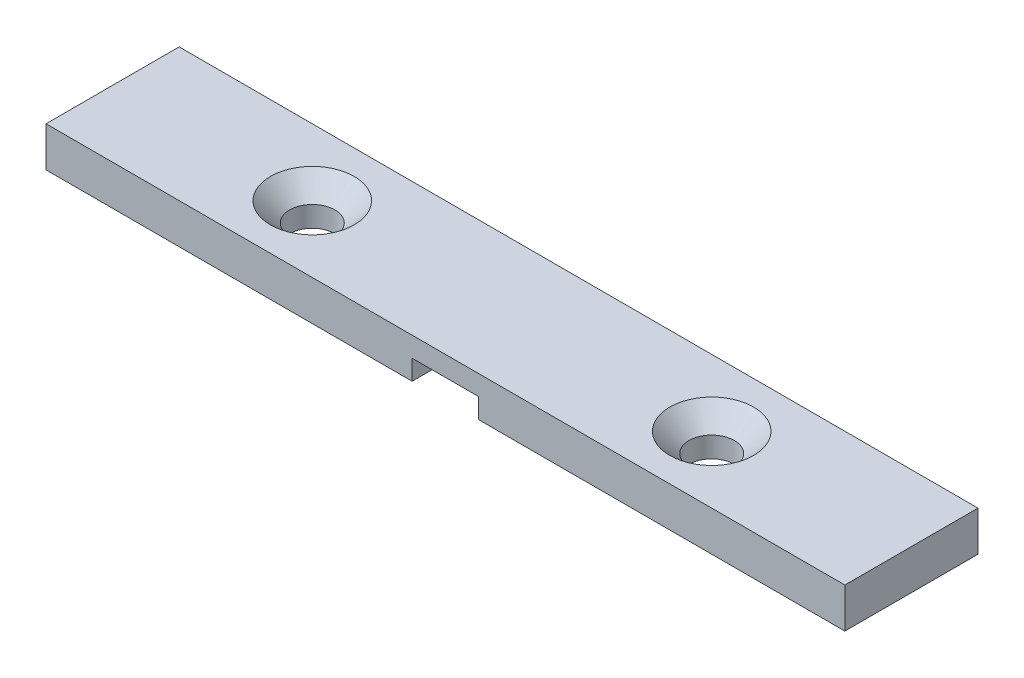
ISO-10303-21;
HEADER;
FILE_DESCRIPTION(('STEP AP214'),'2;1');
FILE_NAME('part.step','',(''),(''),'','','');
FILE_SCHEMA(('AUTOMOTIVE_DESIGN { 1 0 10303 214 1 1 1 1 }'));
ENDSEC;
DATA;
#1=APPLICATION_CONTEXT('core data for automotive mechanical design processes');
#2=APPLICATION_PROTOCOL_DEFINITION('international standard','automotive_design',2000,#1);
#3=PRODUCT_CONTEXT('',#1,'mechanical');
#4=PRODUCT('Part','Part','',(#3));
#5=PRODUCT_RELATED_PRODUCT_CATEGORY('part','',(#4));
#6=PRODUCT_DEFINITION_FORMATION('','',#4);
#7=PRODUCT_DEFINITION_CONTEXT('part definition',#1,'design');
#8=PRODUCT_DEFINITION('design','',#6,#7);
#9=PRODUCT_DEFINITION_SHAPE('','',#8);
#10=(LENGTH_UNIT() NAMED_UNIT(*) SI_UNIT(.MILLI.,.METRE.));
#11=(NAMED_UNIT(*) PLANE_ANGLE_UNIT() SI_UNIT($,.RADIAN.));
#12=(NAMED_UNIT(*) SI_UNIT($,.STERADIAN.) SOLID_ANGLE_UNIT());
#13=UNCERTAINTY_MEASURE_WITH_UNIT(LENGTH_MEASURE(1.E-05),#10,'distance_accuracy_value','');
#14=(GEOMETRIC_REPRESENTATION_CONTEXT(3) GLOBAL_UNCERTAINTY_ASSIGNED_CONTEXT((#13)) GLOBAL_UNIT_ASSIGNED_CONTEXT((#10,
#11,#12)) REPRESENTATION_CONTEXT('',''));
#15=CARTESIAN_POINT('',(0.,0.,0.));
#16=DIRECTION('',(0.,0.,1.));
#17=DIRECTION('',(1.,0.,0.));
#18=AXIS2_PLACEMENT_3D('',#15,#16,#17);
#19=CARTESIAN_POINT('',(30.,3.,-5.));
#20=DIRECTION('',(-1.,0.,0.));
#21=DIRECTION('',(0.,0.,1.));
#22=AXIS2_PLACEMENT_3D('',#19,#20,#21);
#23=PLANE('',#22);
#24=DIRECTION('',(0.,0.,-1.));
#25=VECTOR('',#24,1.);
#26=CARTESIAN_POINT('',(30.,0.,-5.));
#27=LINE('',#26,#25);
#28=CARTESIAN_POINT('',(30.,0.,5.));
#29=VERTEX_POINT('',#28);
#30=CARTESIAN_POINT('',(30.,0.,-5.));
#31=VERTEX_POINT('',#30);
#32=EDGE_CURVE('E157',#29,#31,#27,.T.);
#33=ORIENTED_EDGE('',*,*,#32,.T.);
#34=DIRECTION('',(0.,-1.,0.));
#35=VECTOR('',#34,1.);
#36=CARTESIAN_POINT('',(30.,3.,-5.));
#37=LINE('',#36,#35);
#38=CARTESIAN_POINT('',(30.,3.,-5.));
#39=VERTEX_POINT('',#38);
#40=EDGE_CURVE('E11',#39,#31,#37,.T.);
#41=ORIENTED_EDGE('',*,*,#40,.F.);
#42=DIRECTION('',(0.,0.,-1.));
#43=VECTOR('',#42,1.);
#44=CARTESIAN_POINT('',(30.,3.,-5.));
#45=LINE('',#44,#43);
#46=CARTESIAN_POINT('',(30.,3.,5.));
#47=VERTEX_POINT('',#46);
#48=EDGE_CURVE('E149',#47,#39,#45,.T.);
#49=ORIENTED_EDGE('',*,*,#48,.F.);
#50=DIRECTION('',(0.,-1.,0.));
#51=VECTOR('',#50,1.);
#52=CARTESIAN_POINT('',(30.,3.,5.));
#53=LINE('',#52,#51);
#54=EDGE_CURVE('E156',#47,#29,#53,.T.);
#55=ORIENTED_EDGE('',*,*,#54,.T.);
#56=EDGE_LOOP('',(#33,#41,#49,#55));
#57=FACE_BOUND('',#56,.T.);
#58=ADVANCED_FACE('F36',(#57),#23,.F.);
#59=CARTESIAN_POINT('',(-30.,3.,-5.));
#60=DIRECTION('',(0.,0.,1.));
#61=DIRECTION('',(1.,0.,0.));
#62=AXIS2_PLACEMENT_3D('',#59,#60,#61);
#63=PLANE('',#62);
#64=DIRECTION('',(-1.,0.,0.));
#65=VECTOR('',#64,1.);
#66=CARTESIAN_POINT('',(-30.,0.,-5.));
#67=LINE('',#66,#65);
#68=CARTESIAN_POINT('',(-30.,0.,-5.));
#69=VERTEX_POINT('',#68);
#70=EDGE_CURVE('E160',#31,#69,#67,.T.);
#71=ORIENTED_EDGE('',*,*,#70,.T.);
#72=DIRECTION('',(0.,-1.,0.));
#73=VECTOR('',#72,1.);
#74=CARTESIAN_POINT('',(-30.,3.,-5.));
#75=LINE('',#74,#73);
#76=CARTESIAN_POINT('',(-30.,3.,-5.));
#77=VERTEX_POINT('',#76);
#78=EDGE_CURVE('E44',#77,#69,#75,.T.);
#79=ORIENTED_EDGE('',*,*,#78,.F.);
#80=DIRECTION('',(-1.,0.,0.));
#81=VECTOR('',#80,1.);
#82=CARTESIAN_POINT('',(-30.,3.,-5.));
#83=LINE('',#82,#81);
#84=EDGE_CURVE('E89',#39,#77,#83,.T.);
#85=ORIENTED_EDGE('',*,*,#84,.F.);
#86=ORIENTED_EDGE('',*,*,#40,.T.);
#87=EDGE_LOOP('',(#71,#79,#85,#86));
#88=FACE_BOUND('',#87,.T.);
#89=ADVANCED_FACE('F193',(#88),#63,.F.);
#90=CARTESIAN_POINT('',(-30.,3.,-5.));
#91=DIRECTION('',(1.,0.,0.));
#92=DIRECTION('',(0.,0.,-1.));
#93=AXIS2_PLACEMENT_3D('',#90,#91,#92);
#94=PLANE('',#93);
#95=DIRECTION('',(0.,0.,1.));
#96=VECTOR('',#95,1.);
#97=CARTESIAN_POINT('',(-30.,0.,-5.));
#98=LINE('',#97,#96);
#99=CARTESIAN_POINT('',(-30.,0.,5.));
#100=VERTEX_POINT('',#99);
#101=EDGE_CURVE('E162',#69,#100,#98,.T.);
#102=ORIENTED_EDGE('',*,*,#101,.T.);
#103=DIRECTION('',(0.,-1.,0.));
#104=VECTOR('',#103,1.);
#105=CARTESIAN_POINT('',(-30.,3.,5.));
#106=LINE('',#105,#104);
#107=CARTESIAN_POINT('',(-30.,3.,5.));
#108=VERTEX_POINT('',#107);
#109=EDGE_CURVE('E167',#108,#100,#106,.T.);
#110=ORIENTED_EDGE('',*,*,#109,.F.);
#111=DIRECTION('',(0.,0.,1.));
#112=VECTOR('',#111,1.);
#113=CARTESIAN_POINT('',(-30.,3.,-5.));
#114=LINE('',#113,#112);
#115=EDGE_CURVE('E153',#77,#108,#114,.T.);
#116=ORIENTED_EDGE('',*,*,#115,.F.);
#117=ORIENTED_EDGE('',*,*,#78,.T.);
#118=EDGE_LOOP('',(#102,#110,#116,#117));
#119=FACE_BOUND('',#118,.T.);
#120=ADVANCED_FACE('F198',(#119),#94,.F.);
#121=CARTESIAN_POINT('',(-30.,3.,5.));
#122=DIRECTION('',(0.,0.,-1.));
#123=DIRECTION('',(-1.,0.,0.));
#124=AXIS2_PLACEMENT_3D('',#121,#122,#123);
#125=PLANE('',#124);
#126=DIRECTION('',(1.,0.,0.));
#127=VECTOR('',#126,1.);
#128=CARTESIAN_POINT('',(-30.,0.,5.));
#129=LINE('',#128,#127);
#130=CARTESIAN_POINT('',(-2.5,0.,5.));
#131=VERTEX_POINT('',#130);
#132=EDGE_CURVE('E151',#100,#131,#129,.T.);
#133=ORIENTED_EDGE('',*,*,#132,.T.);
#134=DIRECTION('',(0.,-1.,0.));
#135=VECTOR('',#134,1.);
#136=CARTESIAN_POINT('',(-2.5,0.,5.));
#137=LINE('',#136,#135);
#138=CARTESIAN_POINT('',(-2.5,1.5,5.));
#139=VERTEX_POINT('',#138);
#140=EDGE_CURVE('E314',#139,#131,#137,.T.);
#141=ORIENTED_EDGE('',*,*,#140,.F.);
#142=DIRECTION('',(-1.,0.,0.));
#143=VECTOR('',#142,1.);
#144=CARTESIAN_POINT('',(-2.5,1.5,5.));
#145=LINE('',#144,#143);
#146=CARTESIAN_POINT('',(2.5,1.5,5.));
#147=VERTEX_POINT('',#146);
#148=EDGE_CURVE('E310',#147,#139,#145,.T.);
#149=ORIENTED_EDGE('',*,*,#148,.F.);
#150=DIRECTION('',(0.,1.,0.));
#151=VECTOR('',#150,1.);
#152=CARTESIAN_POINT('',(2.5,0.,5.));
#153=LINE('',#152,#151);
#154=CARTESIAN_POINT('',(2.5,0.,5.));
#155=VERTEX_POINT('',#154);
#156=EDGE_CURVE('E312',#155,#147,#153,.T.);
#157=ORIENTED_EDGE('',*,*,#156,.F.);
#158=EDGE_CURVE('E82',#155,#29,#129,.T.);
#159=ORIENTED_EDGE('',*,*,#158,.T.);
#160=ORIENTED_EDGE('',*,*,#54,.F.);
#161=DIRECTION('',(1.,0.,0.));
#162=VECTOR('',#161,1.);
#163=CARTESIAN_POINT('',(-30.,3.,5.));
#164=LINE('',#163,#162);
#165=EDGE_CURVE('E61',#108,#47,#164,.T.);
#166=ORIENTED_EDGE('',*,*,#165,.F.);
#167=ORIENTED_EDGE('',*,*,#109,.T.);
#168=EDGE_LOOP('',(#133,#141,#149,#157,#159,#160,#166,#167));
#169=FACE_BOUND('',#168,.T.);
#170=ADVANCED_FACE('F207',(#169),#125,.F.);
#171=CARTESIAN_POINT('',(0.,3.,0.));
#172=DIRECTION('',(0.,1.,0.));
#173=DIRECTION('',(0.,0.,1.));
#174=AXIS2_PLACEMENT_3D('',#171,#172,#173);
#175=PLANE('',#174);
#176=CARTESIAN_POINT('',(-15.,3.,0.));
#177=DIRECTION('',(0.,1.,0.));
#178=DIRECTION('',(0.,0.,1.));
#179=AXIS2_PLACEMENT_3D('',#176,#177,#178);
#180=CIRCLE('',#179,3.15);
#181=CARTESIAN_POINT('',(-15.,3.,3.15));
#182=VERTEX_POINT('',#181);
#183=EDGE_CURVE('E136',#182,#182,#180,.T.);
#184=ORIENTED_EDGE('',*,*,#183,.F.);
#185=EDGE_LOOP('',(#184));
#186=FACE_BOUND('',#185,.T.);
#187=CARTESIAN_POINT('',(15.,3.,0.));
#188=DIRECTION('',(0.,1.,0.));
#189=DIRECTION('',(0.,0.,1.));
#190=AXIS2_PLACEMENT_3D('',#187,#188,#189);
#191=CIRCLE('',#190,3.15);
#192=CARTESIAN_POINT('',(15.,3.,3.15));
#193=VERTEX_POINT('',#192);
#194=EDGE_CURVE('E142',#193,#193,#191,.T.);
#195=ORIENTED_EDGE('',*,*,#194,.F.);
#196=EDGE_LOOP('',(#195));
#197=FACE_BOUND('',#196,.T.);
#198=ORIENTED_EDGE('',*,*,#48,.T.);
#199=ORIENTED_EDGE('',*,*,#84,.T.);
#200=ORIENTED_EDGE('',*,*,#115,.T.);
#201=ORIENTED_EDGE('',*,*,#165,.T.);
#202=EDGE_LOOP('',(#198,#199,#200,#201));
#203=FACE_BOUND('',#202,.T.);
#204=ADVANCED_FACE('F188',(#186,#197,#203),#175,.T.);
#205=CARTESIAN_POINT('',(0.,0.,0.));
#206=DIRECTION('',(0.,1.,0.));
#207=DIRECTION('',(0.,0.,1.));
#208=AXIS2_PLACEMENT_3D('',#205,#206,#207);
#209=PLANE('',#208);
#210=CARTESIAN_POINT('',(-15.,0.,0.));
#211=DIRECTION('',(0.,1.,0.));
#212=DIRECTION('',(0.,0.,1.));
#213=AXIS2_PLACEMENT_3D('',#210,#211,#212);
#214=CIRCLE('',#213,1.7);
#215=CARTESIAN_POINT('',(-15.,0.,1.7));
#216=VERTEX_POINT('',#215);
#217=EDGE_CURVE('E39',#216,#216,#214,.T.);
#218=ORIENTED_EDGE('',*,*,#217,.T.);
#219=EDGE_LOOP('',(#218));
#220=FACE_BOUND('',#219,.T.);
#221=CARTESIAN_POINT('',(15.,0.,0.));
#222=DIRECTION('',(0.,1.,0.));
#223=DIRECTION('',(0.,0.,1.));
#224=AXIS2_PLACEMENT_3D('',#221,#222,#223);
#225=CIRCLE('',#224,1.7);
#226=CARTESIAN_POINT('',(15.,0.,1.7));
#227=VERTEX_POINT('',#226);
#228=EDGE_CURVE('E148',#227,#227,#225,.T.);
#229=ORIENTED_EDGE('',*,*,#228,.T.);
#230=EDGE_LOOP('',(#229));
#231=FACE_BOUND('',#230,.T.);
#232=DIRECTION('',(1.,0.,0.));
#233=VECTOR('',#232,1.);
#234=CARTESIAN_POINT('',(-2.5,0.,-3.5));
#235=LINE('',#234,#233);
#236=CARTESIAN_POINT('',(-2.5,0.,-3.5));
#237=VERTEX_POINT('',#236);
#238=CARTESIAN_POINT('',(2.5,0.,-3.5));
#239=VERTEX_POINT('',#238);
#240=EDGE_CURVE('E120',#237,#239,#235,.T.);
#241=ORIENTED_EDGE('',*,*,#240,.F.);
#242=DIRECTION('',(0.,0.,1.));
#243=VECTOR('',#242,1.);
#244=CARTESIAN_POINT('',(-2.5,0.,-3.5));
#245=LINE('',#244,#243);
#246=EDGE_CURVE('E129',#237,#131,#245,.T.);
#247=ORIENTED_EDGE('',*,*,#246,.T.);
#248=ORIENTED_EDGE('',*,*,#132,.F.);
#249=ORIENTED_EDGE('',*,*,#101,.F.);
#250=ORIENTED_EDGE('',*,*,#70,.F.);
#251=ORIENTED_EDGE('',*,*,#32,.F.);
#252=ORIENTED_EDGE('',*,*,#158,.F.);
#253=DIRECTION('',(0.,0.,1.));
#254=VECTOR('',#253,1.);
#255=CARTESIAN_POINT('',(2.5,0.,-3.5));
#256=LINE('',#255,#254);
#257=EDGE_CURVE('E116',#239,#155,#256,.T.);
#258=ORIENTED_EDGE('',*,*,#257,.F.);
#259=EDGE_LOOP('',(#241,#247,#248,#249,#250,#251,#252,#258));
#260=FACE_BOUND('',#259,.T.);
#261=ADVANCED_FACE('F127',(#220,#231,#260),#209,.F.);
#262=CARTESIAN_POINT('',(15.,3.,0.));
#263=DIRECTION('',(0.,1.,0.));
#264=DIRECTION('',(0.,0.,1.));
#265=AXIS2_PLACEMENT_3D('',#262,#263,#264);
#266=CYLINDRICAL_SURFACE('',#265,1.7);
#267=CARTESIAN_POINT('',(15.,1.55,0.));
#268=DIRECTION('',(0.,1.,0.));
#269=DIRECTION('',(0.,0.,1.));
#270=AXIS2_PLACEMENT_3D('',#267,#268,#269);
#271=CIRCLE('',#270,1.7);
#272=CARTESIAN_POINT('',(15.,1.55,1.7));
#273=VERTEX_POINT('',#272);
#274=EDGE_CURVE('E145',#273,#273,#271,.T.);
#275=ORIENTED_EDGE('',*,*,#274,.T.);
#276=EDGE_LOOP('',(#275));
#277=FACE_BOUND('',#276,.T.);
#278=ORIENTED_EDGE('',*,*,#228,.F.);
#279=EDGE_LOOP('',(#278));
#280=FACE_BOUND('',#279,.T.);
#281=ADVANCED_FACE('F175',(#277,#280),#266,.F.);
#282=CARTESIAN_POINT('',(15.,3.,0.));
#283=DIRECTION('',(0.,1.,0.));
#284=DIRECTION('',(0.,0.,1.));
#285=AXIS2_PLACEMENT_3D('',#282,#283,#284);
#286=CONICAL_SURFACE('',#285,3.15,0.785398163397449);
#287=ORIENTED_EDGE('',*,*,#274,.F.);
#288=EDGE_LOOP('',(#287));
#289=FACE_BOUND('',#288,.T.);
#290=ORIENTED_EDGE('',*,*,#194,.T.);
#291=EDGE_LOOP('',(#290));
#292=FACE_BOUND('',#291,.T.);
#293=ADVANCED_FACE('F177',(#289,#292),#286,.F.);
#294=CARTESIAN_POINT('',(-15.,3.,0.));
#295=DIRECTION('',(0.,1.,0.));
#296=DIRECTION('',(0.,0.,1.));
#297=AXIS2_PLACEMENT_3D('',#294,#295,#296);
#298=CYLINDRICAL_SURFACE('',#297,1.7);
#299=CARTESIAN_POINT('',(-15.,1.55,0.));
#300=DIRECTION('',(0.,1.,0.));
#301=DIRECTION('',(0.,0.,1.));
#302=AXIS2_PLACEMENT_3D('',#299,#300,#301);
#303=CIRCLE('',#302,1.7);
#304=CARTESIAN_POINT('',(-15.,1.55,1.7));
#305=VERTEX_POINT('',#304);
#306=EDGE_CURVE('E139',#305,#305,#303,.T.);
#307=ORIENTED_EDGE('',*,*,#306,.T.);
#308=EDGE_LOOP('',(#307));
#309=FACE_BOUND('',#308,.T.);
#310=ORIENTED_EDGE('',*,*,#217,.F.);
#311=EDGE_LOOP('',(#310));
#312=FACE_BOUND('',#311,.T.);
#313=ADVANCED_FACE('F184',(#309,#312),#298,.F.);
#314=CARTESIAN_POINT('',(-15.,3.,0.));
#315=DIRECTION('',(0.,1.,0.));
#316=DIRECTION('',(0.,0.,1.));
#317=AXIS2_PLACEMENT_3D('',#314,#315,#316);
#318=CONICAL_SURFACE('',#317,3.15,0.785398163397449);
#319=ORIENTED_EDGE('',*,*,#306,.F.);
#320=EDGE_LOOP('',(#319));
#321=FACE_BOUND('',#320,.T.);
#322=ORIENTED_EDGE('',*,*,#183,.T.);
#323=EDGE_LOOP('',(#322));
#324=FACE_BOUND('',#323,.T.);
#325=ADVANCED_FACE('F231',(#321,#324),#318,.F.);
#326=CARTESIAN_POINT('',(-2.5,0.,-3.5));
#327=DIRECTION('',(-1.,0.,0.));
#328=DIRECTION('',(0.,0.,1.));
#329=AXIS2_PLACEMENT_3D('',#326,#327,#328);
#330=PLANE('',#329);
#331=ORIENTED_EDGE('',*,*,#140,.T.);
#332=ORIENTED_EDGE('',*,*,#246,.F.);
#333=DIRECTION('',(0.,-1.,0.));
#334=VECTOR('',#333,1.);
#335=CARTESIAN_POINT('',(-2.5,0.,-3.5));
#336=LINE('',#335,#334);
#337=CARTESIAN_POINT('',(-2.5,1.5,-3.5));
#338=VERTEX_POINT('',#337);
#339=EDGE_CURVE('E52',#338,#237,#336,.T.);
#340=ORIENTED_EDGE('',*,*,#339,.F.);
#341=DIRECTION('',(0.,0.,1.));
#342=VECTOR('',#341,1.);
#343=CARTESIAN_POINT('',(-2.5,1.5,-3.5));
#344=LINE('',#343,#342);
#345=EDGE_CURVE('E131',#338,#139,#344,.T.);
#346=ORIENTED_EDGE('',*,*,#345,.T.);
#347=EDGE_LOOP('',(#331,#332,#340,#346));
#348=FACE_BOUND('',#347,.T.);
#349=ADVANCED_FACE('F240',(#348),#330,.F.);
#350=CARTESIAN_POINT('',(-2.5,1.5,-3.5));
#351=DIRECTION('',(0.,1.,0.));
#352=DIRECTION('',(0.,0.,1.));
#353=AXIS2_PLACEMENT_3D('',#350,#351,#352);
#354=PLANE('',#353);
#355=ORIENTED_EDGE('',*,*,#148,.T.);
#356=ORIENTED_EDGE('',*,*,#345,.F.);
#357=DIRECTION('',(-1.,0.,0.));
#358=VECTOR('',#357,1.);
#359=CARTESIAN_POINT('',(-2.5,1.5,-3.5));
#360=LINE('',#359,#358);
#361=CARTESIAN_POINT('',(2.5,1.5,-3.5));
#362=VERTEX_POINT('',#361);
#363=EDGE_CURVE('E119',#362,#338,#360,.T.);
#364=ORIENTED_EDGE('',*,*,#363,.F.);
#365=DIRECTION('',(0.,0.,1.));
#366=VECTOR('',#365,1.);
#367=CARTESIAN_POINT('',(2.5,1.5,-3.5));
#368=LINE('',#367,#366);
#369=EDGE_CURVE('E117',#362,#147,#368,.T.);
#370=ORIENTED_EDGE('',*,*,#369,.T.);
#371=EDGE_LOOP('',(#355,#356,#364,#370));
#372=FACE_BOUND('',#371,.T.);
#373=ADVANCED_FACE('F245',(#372),#354,.F.);
#374=CARTESIAN_POINT('',(2.5,0.,-3.5));
#375=DIRECTION('',(1.,0.,0.));
#376=DIRECTION('',(0.,1.,0.));
#377=AXIS2_PLACEMENT_3D('',#374,#375,#376);
#378=PLANE('',#377);
#379=ORIENTED_EDGE('',*,*,#156,.T.);
#380=ORIENTED_EDGE('',*,*,#369,.F.);
#381=DIRECTION('',(0.,1.,0.));
#382=VECTOR('',#381,1.);
#383=CARTESIAN_POINT('',(2.5,0.,-3.5));
#384=LINE('',#383,#382);
#385=EDGE_CURVE('E112',#239,#362,#384,.T.);
#386=ORIENTED_EDGE('',*,*,#385,.F.);
#387=ORIENTED_EDGE('',*,*,#257,.T.);
#388=EDGE_LOOP('',(#379,#380,#386,#387));
#389=FACE_BOUND('',#388,.T.);
#390=ADVANCED_FACE('F114',(#389),#378,.F.);
#391=CARTESIAN_POINT('',(0.,0.,-3.5));
#392=DIRECTION('',(0.,0.,-1.));
#393=DIRECTION('',(-1.,0.,0.));
#394=AXIS2_PLACEMENT_3D('',#391,#392,#393);
#395=PLANE('',#394);
#396=ORIENTED_EDGE('',*,*,#339,.T.);
#397=ORIENTED_EDGE('',*,*,#240,.T.);
#398=ORIENTED_EDGE('',*,*,#385,.T.);
#399=ORIENTED_EDGE('',*,*,#363,.T.);
#400=EDGE_LOOP('',(#396,#397,#398,#399));
#401=FACE_BOUND('',#400,.T.);
#402=ADVANCED_FACE('F123',(#401),#395,.F.);
#403=CLOSED_SHELL('',(#58,#89,#120,#170,#204,#261,#281,#293,#313,#325,#349,#373,#390,#402));
#404=MANIFOLD_SOLID_BREP('B2',#403);
#405=ADVANCED_BREP_SHAPE_REPRESENTATION('',(#18,#404),#14);
#406=SHAPE_DEFINITION_REPRESENTATION(#9,#405);
ENDSEC;
END-ISO-10303-21;
